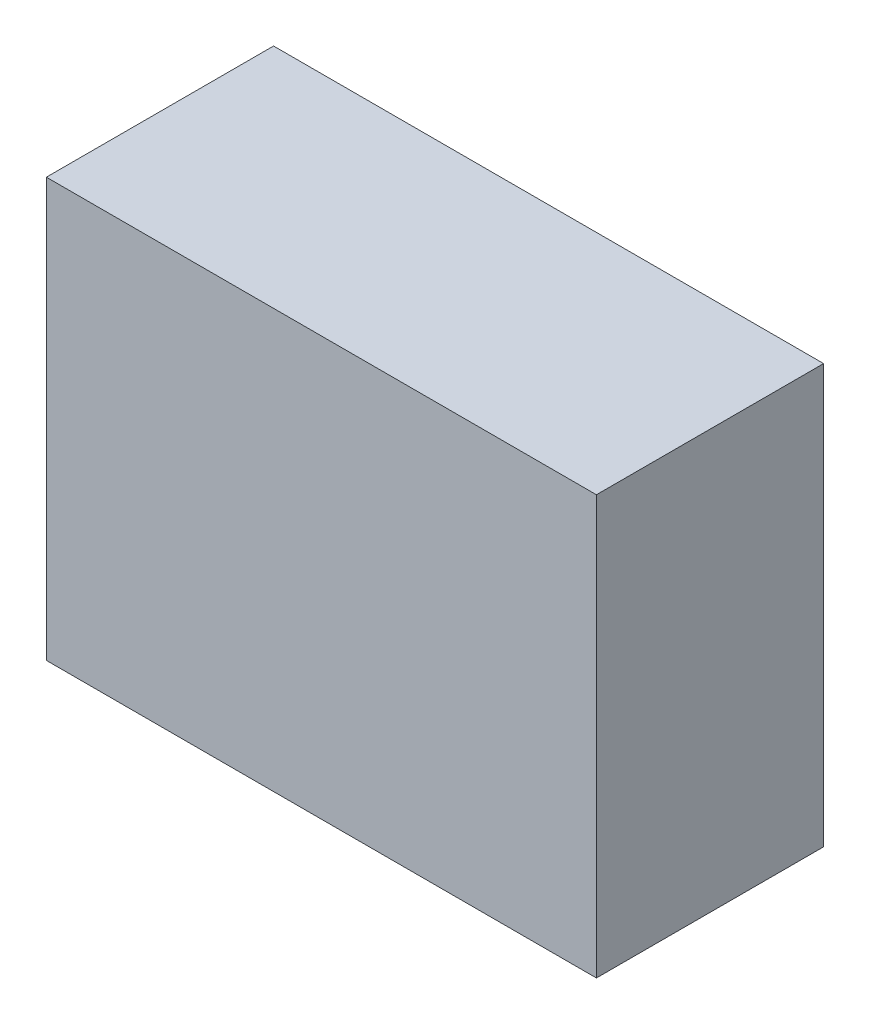
ISO-10303-21;
HEADER;
FILE_DESCRIPTION(('STEP AP214'),'2;1');
FILE_NAME('part.step','',(''),(''),'','','');
FILE_SCHEMA(('AUTOMOTIVE_DESIGN { 1 0 10303 214 1 1 1 1 }'));
ENDSEC;
DATA;
#1=APPLICATION_CONTEXT('core data for automotive mechanical design processes');
#2=APPLICATION_PROTOCOL_DEFINITION('international standard','automotive_design',2000,#1);
#3=PRODUCT_CONTEXT('',#1,'mechanical');
#4=PRODUCT('Part','Part','',(#3));
#5=PRODUCT_RELATED_PRODUCT_CATEGORY('part','',(#4));
#6=PRODUCT_DEFINITION_FORMATION('','',#4);
#7=PRODUCT_DEFINITION_CONTEXT('part definition',#1,'design');
#8=PRODUCT_DEFINITION('design','',#6,#7);
#9=PRODUCT_DEFINITION_SHAPE('','',#8);
#10=(LENGTH_UNIT() NAMED_UNIT(*) SI_UNIT(.MILLI.,.METRE.));
#11=(NAMED_UNIT(*) PLANE_ANGLE_UNIT() SI_UNIT($,.RADIAN.));
#12=(NAMED_UNIT(*) SI_UNIT($,.STERADIAN.) SOLID_ANGLE_UNIT());
#13=UNCERTAINTY_MEASURE_WITH_UNIT(LENGTH_MEASURE(1.E-05),#10,'distance_accuracy_value','');
#14=(GEOMETRIC_REPRESENTATION_CONTEXT(3) GLOBAL_UNCERTAINTY_ASSIGNED_CONTEXT((#13)) GLOBAL_UNIT_ASSIGNED_CONTEXT((#10,
#11,#12)) REPRESENTATION_CONTEXT('',''));
#15=CARTESIAN_POINT('',(0.,0.,0.));
#16=DIRECTION('',(0.,0.,1.));
#17=DIRECTION('',(1.,0.,0.));
#18=AXIS2_PLACEMENT_3D('',#15,#16,#17);
#19=CARTESIAN_POINT('',(0.,0.,1.9));
#20=DIRECTION('',(1.,0.,0.));
#21=DIRECTION('',(0.,0.,-1.));
#22=AXIS2_PLACEMENT_3D('',#19,#20,#21);
#23=PLANE('',#22);
#24=DIRECTION('',(0.,-1.,0.));
#25=VECTOR('',#24,1.);
#26=CARTESIAN_POINT('',(0.,0.,0.));
#27=LINE('',#26,#25);
#28=CARTESIAN_POINT('',(0.,3.5,0.));
#29=VERTEX_POINT('',#28);
#30=CARTESIAN_POINT('',(0.,0.,0.));
#31=VERTEX_POINT('',#30);
#32=EDGE_CURVE('E95',#29,#31,#27,.T.);
#33=ORIENTED_EDGE('',*,*,#32,.T.);
#34=DIRECTION('',(0.,0.,-1.));
#35=VECTOR('',#34,1.);
#36=CARTESIAN_POINT('',(0.,0.,1.9));
#37=LINE('',#36,#35);
#38=CARTESIAN_POINT('',(0.,0.,1.9));
#39=VERTEX_POINT('',#38);
#40=EDGE_CURVE('E11',#39,#31,#37,.T.);
#41=ORIENTED_EDGE('',*,*,#40,.F.);
#42=DIRECTION('',(0.,-1.,0.));
#43=VECTOR('',#42,1.);
#44=CARTESIAN_POINT('',(0.,0.,1.9));
#45=LINE('',#44,#43);
#46=CARTESIAN_POINT('',(0.,3.5,1.9));
#47=VERTEX_POINT('',#46);
#48=EDGE_CURVE('E83',#47,#39,#45,.T.);
#49=ORIENTED_EDGE('',*,*,#48,.F.);
#50=DIRECTION('',(0.,0.,-1.));
#51=VECTOR('',#50,1.);
#52=CARTESIAN_POINT('',(0.,3.5,1.9));
#53=LINE('',#52,#51);
#54=EDGE_CURVE('E91',#47,#29,#53,.T.);
#55=ORIENTED_EDGE('',*,*,#54,.T.);
#56=EDGE_LOOP('',(#33,#41,#49,#55));
#57=FACE_BOUND('',#56,.T.);
#58=ADVANCED_FACE('F32',(#57),#23,.F.);
#59=CARTESIAN_POINT('',(0.,0.,1.9));
#60=DIRECTION('',(0.,1.,0.));
#61=DIRECTION('',(0.,0.,1.));
#62=AXIS2_PLACEMENT_3D('',#59,#60,#61);
#63=PLANE('',#62);
#64=DIRECTION('',(1.,0.,0.));
#65=VECTOR('',#64,1.);
#66=CARTESIAN_POINT('',(0.,0.,0.));
#67=LINE('',#66,#65);
#68=CARTESIAN_POINT('',(4.6,0.,0.));
#69=VERTEX_POINT('',#68);
#70=EDGE_CURVE('E87',#31,#69,#67,.T.);
#71=ORIENTED_EDGE('',*,*,#70,.T.);
#72=DIRECTION('',(0.,0.,-1.));
#73=VECTOR('',#72,1.);
#74=CARTESIAN_POINT('',(4.6,0.,1.9));
#75=LINE('',#74,#73);
#76=CARTESIAN_POINT('',(4.6,0.,1.9));
#77=VERTEX_POINT('',#76);
#78=EDGE_CURVE('E40',#77,#69,#75,.T.);
#79=ORIENTED_EDGE('',*,*,#78,.F.);
#80=DIRECTION('',(1.,0.,0.));
#81=VECTOR('',#80,1.);
#82=CARTESIAN_POINT('',(0.,0.,1.9));
#83=LINE('',#82,#81);
#84=EDGE_CURVE('E78',#39,#77,#83,.T.);
#85=ORIENTED_EDGE('',*,*,#84,.F.);
#86=ORIENTED_EDGE('',*,*,#40,.T.);
#87=EDGE_LOOP('',(#71,#79,#85,#86));
#88=FACE_BOUND('',#87,.T.);
#89=ADVANCED_FACE('F86',(#88),#63,.F.);
#90=CARTESIAN_POINT('',(4.6,0.,1.9));
#91=DIRECTION('',(-1.,0.,0.));
#92=DIRECTION('',(0.,0.,1.));
#93=AXIS2_PLACEMENT_3D('',#90,#91,#92);
#94=PLANE('',#93);
#95=DIRECTION('',(0.,1.,0.));
#96=VECTOR('',#95,1.);
#97=CARTESIAN_POINT('',(4.6,0.,0.));
#98=LINE('',#97,#96);
#99=CARTESIAN_POINT('',(4.6,3.5,0.));
#100=VERTEX_POINT('',#99);
#101=EDGE_CURVE('E65',#69,#100,#98,.T.);
#102=ORIENTED_EDGE('',*,*,#101,.T.);
#103=DIRECTION('',(0.,0.,-1.));
#104=VECTOR('',#103,1.);
#105=CARTESIAN_POINT('',(4.6,3.5,1.9));
#106=LINE('',#105,#104);
#107=CARTESIAN_POINT('',(4.6,3.5,1.9));
#108=VERTEX_POINT('',#107);
#109=EDGE_CURVE('E88',#108,#100,#106,.T.);
#110=ORIENTED_EDGE('',*,*,#109,.F.);
#111=DIRECTION('',(0.,1.,0.));
#112=VECTOR('',#111,1.);
#113=CARTESIAN_POINT('',(4.6,0.,1.9));
#114=LINE('',#113,#112);
#115=EDGE_CURVE('E81',#77,#108,#114,.T.);
#116=ORIENTED_EDGE('',*,*,#115,.F.);
#117=ORIENTED_EDGE('',*,*,#78,.T.);
#118=EDGE_LOOP('',(#102,#110,#116,#117));
#119=FACE_BOUND('',#118,.T.);
#120=ADVANCED_FACE('F89',(#119),#94,.F.);
#121=CARTESIAN_POINT('',(0.,3.5,1.9));
#122=DIRECTION('',(0.,-1.,0.));
#123=DIRECTION('',(0.,0.,-1.));
#124=AXIS2_PLACEMENT_3D('',#121,#122,#123);
#125=PLANE('',#124);
#126=DIRECTION('',(-1.,0.,0.));
#127=VECTOR('',#126,1.);
#128=CARTESIAN_POINT('',(0.,3.5,0.));
#129=LINE('',#128,#127);
#130=EDGE_CURVE('E71',#100,#29,#129,.T.);
#131=ORIENTED_EDGE('',*,*,#130,.T.);
#132=ORIENTED_EDGE('',*,*,#54,.F.);
#133=DIRECTION('',(-1.,0.,0.));
#134=VECTOR('',#133,1.);
#135=CARTESIAN_POINT('',(0.,3.5,1.9));
#136=LINE('',#135,#134);
#137=EDGE_CURVE('E48',#108,#47,#136,.T.);
#138=ORIENTED_EDGE('',*,*,#137,.F.);
#139=ORIENTED_EDGE('',*,*,#109,.T.);
#140=EDGE_LOOP('',(#131,#132,#138,#139));
#141=FACE_BOUND('',#140,.T.);
#142=ADVANCED_FACE('F102',(#141),#125,.F.);
#143=CARTESIAN_POINT('',(0.,0.,1.9));
#144=DIRECTION('',(0.,0.,-1.));
#145=DIRECTION('',(-1.,0.,0.));
#146=AXIS2_PLACEMENT_3D('',#143,#144,#145);
#147=PLANE('',#146);
#148=ORIENTED_EDGE('',*,*,#48,.T.);
#149=ORIENTED_EDGE('',*,*,#84,.T.);
#150=ORIENTED_EDGE('',*,*,#115,.T.);
#151=ORIENTED_EDGE('',*,*,#137,.T.);
#152=EDGE_LOOP('',(#148,#149,#150,#151));
#153=FACE_BOUND('',#152,.T.);
#154=ADVANCED_FACE('F79',(#153),#147,.F.);
#155=CARTESIAN_POINT('',(0.,0.,0.));
#156=DIRECTION('',(0.,0.,-1.));
#157=DIRECTION('',(-1.,0.,0.));
#158=AXIS2_PLACEMENT_3D('',#155,#156,#157);
#159=PLANE('',#158);
#160=ORIENTED_EDGE('',*,*,#32,.F.);
#161=ORIENTED_EDGE('',*,*,#130,.F.);
#162=ORIENTED_EDGE('',*,*,#101,.F.);
#163=ORIENTED_EDGE('',*,*,#70,.F.);
#164=EDGE_LOOP('',(#160,#161,#162,#163));
#165=FACE_BOUND('',#164,.T.);
#166=ADVANCED_FACE('F105',(#165),#159,.T.);
#167=CLOSED_SHELL('',(#58,#89,#120,#142,#154,#166));
#168=MANIFOLD_SOLID_BREP('B2',#167);
#169=ADVANCED_BREP_SHAPE_REPRESENTATION('',(#18,#168),#14);
#170=SHAPE_DEFINITION_REPRESENTATION(#9,#169);
ENDSEC;
END-ISO-10303-21;
